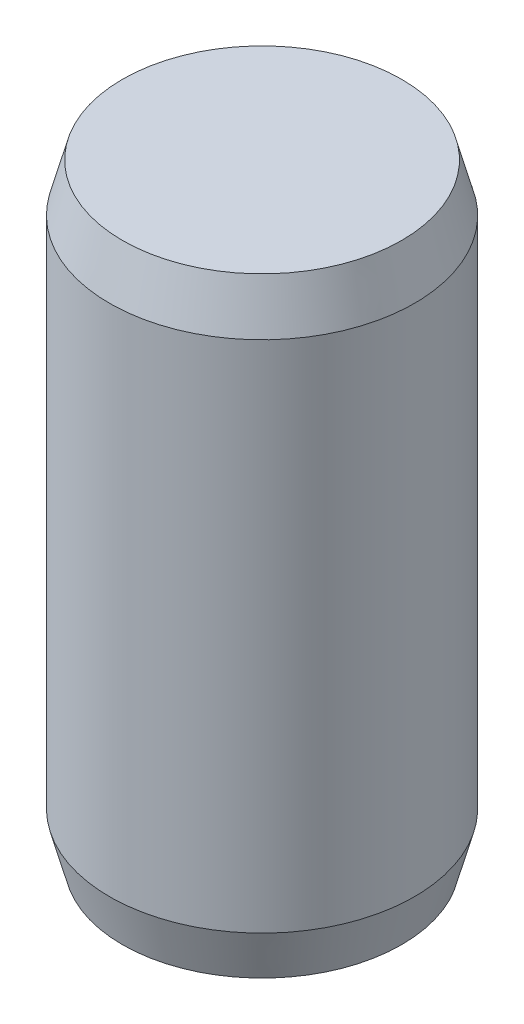
ISO-10303-21;
HEADER;
FILE_DESCRIPTION(('STEP AP214'),'2;1');
FILE_NAME('part.step','',(''),(''),'','','');
FILE_SCHEMA(('AUTOMOTIVE_DESIGN { 1 0 10303 214 1 1 1 1 }'));
ENDSEC;
DATA;
#1=APPLICATION_CONTEXT('core data for automotive mechanical design processes');
#2=APPLICATION_PROTOCOL_DEFINITION('international standard','automotive_design',2000,#1);
#3=PRODUCT_CONTEXT('',#1,'mechanical');
#4=PRODUCT('Part','Part','',(#3));
#5=PRODUCT_RELATED_PRODUCT_CATEGORY('part','',(#4));
#6=PRODUCT_DEFINITION_FORMATION('','',#4);
#7=PRODUCT_DEFINITION_CONTEXT('part definition',#1,'design');
#8=PRODUCT_DEFINITION('design','',#6,#7);
#9=PRODUCT_DEFINITION_SHAPE('','',#8);
#10=(LENGTH_UNIT() NAMED_UNIT(*) SI_UNIT(.MILLI.,.METRE.));
#11=(NAMED_UNIT(*) PLANE_ANGLE_UNIT() SI_UNIT($,.RADIAN.));
#12=(NAMED_UNIT(*) SI_UNIT($,.STERADIAN.) SOLID_ANGLE_UNIT());
#13=UNCERTAINTY_MEASURE_WITH_UNIT(LENGTH_MEASURE(1.E-05),#10,'distance_accuracy_value','');
#14=(GEOMETRIC_REPRESENTATION_CONTEXT(3) GLOBAL_UNCERTAINTY_ASSIGNED_CONTEXT((#13)) GLOBAL_UNIT_ASSIGNED_CONTEXT((#10,
#11,#12)) REPRESENTATION_CONTEXT('',''));
#15=CARTESIAN_POINT('',(0.,0.,0.));
#16=DIRECTION('',(0.,0.,1.));
#17=DIRECTION('',(1.,0.,0.));
#18=AXIS2_PLACEMENT_3D('',#15,#16,#17);
#19=CARTESIAN_POINT('',(0.,-4.,0.));
#20=DIRECTION('',(0.,-1.,0.));
#21=DIRECTION('',(1.,0.,0.));
#22=AXIS2_PLACEMENT_3D('',#19,#20,#21);
#23=CYLINDRICAL_SURFACE('',#22,2.);
#24=CARTESIAN_POINT('',(0.,-3.37,0.));
#25=DIRECTION('',(0.,1.,0.));
#26=DIRECTION('',(-1.,0.,0.));
#27=AXIS2_PLACEMENT_3D('',#24,#25,#26);
#28=CIRCLE('',#27,2.);
#29=CARTESIAN_POINT('',(-2.,-3.37,0.));
#30=VERTEX_POINT('',#29);
#31=EDGE_CURVE('E45',#30,#30,#28,.T.);
#32=ORIENTED_EDGE('',*,*,#31,.T.);
#33=EDGE_LOOP('',(#32));
#34=FACE_BOUND('',#33,.T.);
#35=CARTESIAN_POINT('',(0.,3.37,0.));
#36=DIRECTION('',(0.,1.,0.));
#37=DIRECTION('',(-1.,0.,0.));
#38=AXIS2_PLACEMENT_3D('',#35,#36,#37);
#39=CIRCLE('',#38,2.);
#40=CARTESIAN_POINT('',(-2.,3.37,0.));
#41=VERTEX_POINT('',#40);
#42=EDGE_CURVE('E53',#41,#41,#39,.T.);
#43=ORIENTED_EDGE('',*,*,#42,.F.);
#44=EDGE_LOOP('',(#43));
#45=FACE_BOUND('',#44,.T.);
#46=ADVANCED_FACE('F39',(#34,#45),#23,.T.);
#47=CARTESIAN_POINT('',(0.,-3.37,0.));
#48=DIRECTION('',(0.,1.,0.));
#49=DIRECTION('',(-1.,0.,0.));
#50=AXIS2_PLACEMENT_3D('',#47,#48,#49);
#51=CONICAL_SURFACE('',#50,2.,0.261799387799143);
#52=CARTESIAN_POINT('',(0.,-4.,0.));
#53=DIRECTION('',(0.,1.,0.));
#54=DIRECTION('',(-1.,0.,0.));
#55=AXIS2_PLACEMENT_3D('',#52,#53,#54);
#56=CIRCLE('',#55,1.8311920087684);
#57=CARTESIAN_POINT('',(-1.8311920087684,-4.,0.));
#58=VERTEX_POINT('',#57);
#59=EDGE_CURVE('E10',#58,#58,#56,.T.);
#60=ORIENTED_EDGE('',*,*,#59,.T.);
#61=EDGE_LOOP('',(#60));
#62=FACE_BOUND('',#61,.T.);
#63=ORIENTED_EDGE('',*,*,#31,.F.);
#64=EDGE_LOOP('',(#63));
#65=FACE_BOUND('',#64,.T.);
#66=ADVANCED_FACE('F62',(#62,#65),#51,.T.);
#67=CARTESIAN_POINT('',(0.,-4.,0.));
#68=DIRECTION('',(0.,-1.,0.));
#69=DIRECTION('',(1.,0.,0.));
#70=AXIS2_PLACEMENT_3D('',#67,#68,#69);
#71=PLANE('',#70);
#72=ORIENTED_EDGE('',*,*,#59,.F.);
#73=EDGE_LOOP('',(#72));
#74=FACE_BOUND('',#73,.T.);
#75=ADVANCED_FACE('F68',(#74),#71,.T.);
#76=CARTESIAN_POINT('',(0.,3.37,0.));
#77=DIRECTION('',(0.,-1.,0.));
#78=DIRECTION('',(-1.,0.,0.));
#79=AXIS2_PLACEMENT_3D('',#76,#77,#78);
#80=CONICAL_SURFACE('',#79,2.,0.261799387799143);
#81=CARTESIAN_POINT('',(0.,4.,0.));
#82=DIRECTION('',(0.,1.,0.));
#83=DIRECTION('',(-1.,0.,0.));
#84=AXIS2_PLACEMENT_3D('',#81,#82,#83);
#85=CIRCLE('',#84,1.8311920087684);
#86=CARTESIAN_POINT('',(-1.8311920087684,4.,0.));
#87=VERTEX_POINT('',#86);
#88=EDGE_CURVE('E49',#87,#87,#85,.T.);
#89=ORIENTED_EDGE('',*,*,#88,.F.);
#90=EDGE_LOOP('',(#89));
#91=FACE_BOUND('',#90,.T.);
#92=ORIENTED_EDGE('',*,*,#42,.T.);
#93=EDGE_LOOP('',(#92));
#94=FACE_BOUND('',#93,.T.);
#95=ADVANCED_FACE('F59',(#91,#94),#80,.T.);
#96=CARTESIAN_POINT('',(0.,4.,0.));
#97=DIRECTION('',(0.,1.,0.));
#98=DIRECTION('',(-1.,0.,0.));
#99=AXIS2_PLACEMENT_3D('',#96,#97,#98);
#100=PLANE('',#99);
#101=ORIENTED_EDGE('',*,*,#88,.T.);
#102=EDGE_LOOP('',(#101));
#103=FACE_BOUND('',#102,.T.);
#104=ADVANCED_FACE('F76',(#103),#100,.T.);
#105=CLOSED_SHELL('',(#46,#66,#75,#95,#104));
#106=MANIFOLD_SOLID_BREP('B2',#105);
#107=ADVANCED_BREP_SHAPE_REPRESENTATION('',(#18,#106),#14);
#108=SHAPE_DEFINITION_REPRESENTATION(#9,#107);
ENDSEC;
END-ISO-10303-21;
